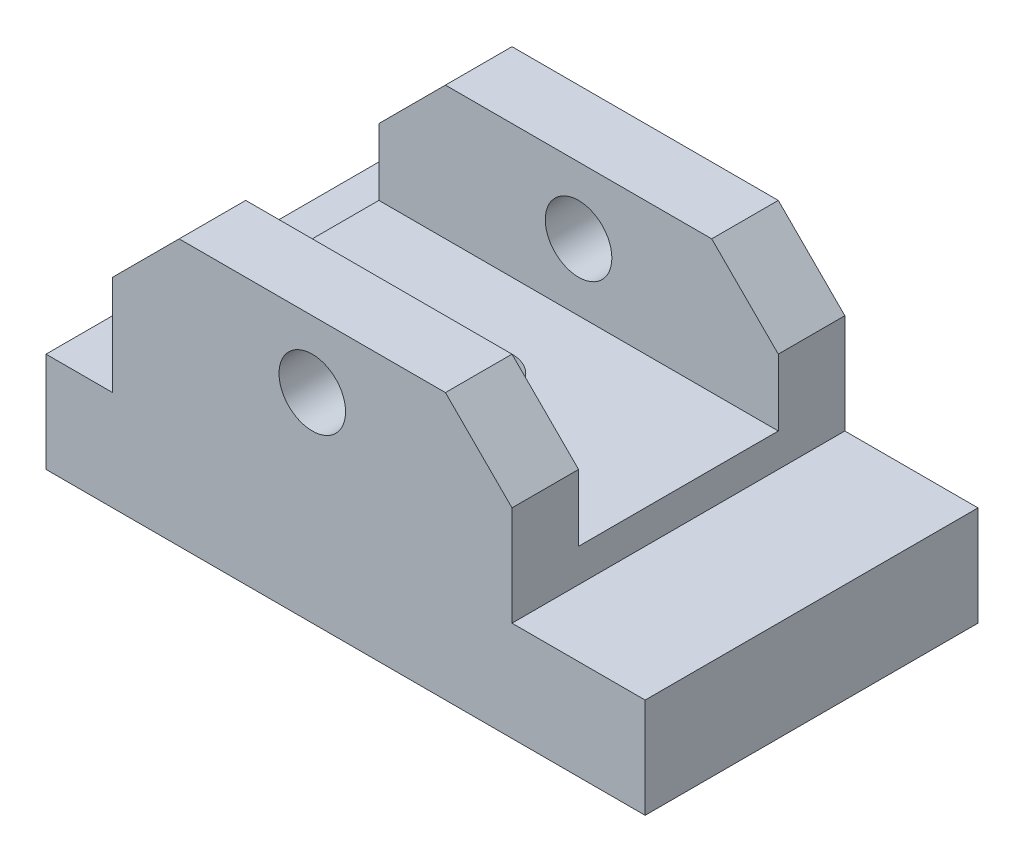
ISO-10303-21;
HEADER;
FILE_DESCRIPTION(('STEP AP214'),'2;1');
FILE_NAME('part.step','',(''),(''),'','','');
FILE_SCHEMA(('AUTOMOTIVE_DESIGN { 1 0 10303 214 1 1 1 1 }'));
ENDSEC;
DATA;
#1=APPLICATION_CONTEXT('core data for automotive mechanical design processes');
#2=APPLICATION_PROTOCOL_DEFINITION('international standard','automotive_design',2000,#1);
#3=PRODUCT_CONTEXT('',#1,'mechanical');
#4=PRODUCT('Part','Part','',(#3));
#5=PRODUCT_RELATED_PRODUCT_CATEGORY('part','',(#4));
#6=PRODUCT_DEFINITION_FORMATION('','',#4);
#7=PRODUCT_DEFINITION_CONTEXT('part definition',#1,'design');
#8=PRODUCT_DEFINITION('design','',#6,#7);
#9=PRODUCT_DEFINITION_SHAPE('','',#8);
#10=(LENGTH_UNIT() NAMED_UNIT(*) SI_UNIT(.MILLI.,.METRE.));
#11=(NAMED_UNIT(*) PLANE_ANGLE_UNIT() SI_UNIT($,.RADIAN.));
#12=(NAMED_UNIT(*) SI_UNIT($,.STERADIAN.) SOLID_ANGLE_UNIT());
#13=UNCERTAINTY_MEASURE_WITH_UNIT(LENGTH_MEASURE(1.E-05),#10,'distance_accuracy_value','');
#14=(GEOMETRIC_REPRESENTATION_CONTEXT(3) GLOBAL_UNCERTAINTY_ASSIGNED_CONTEXT((#13)) GLOBAL_UNIT_ASSIGNED_CONTEXT((#10,
#11,#12)) REPRESENTATION_CONTEXT('',''));
#15=CARTESIAN_POINT('',(0.,0.,0.));
#16=DIRECTION('',(0.,0.,1.));
#17=DIRECTION('',(1.,0.,0.));
#18=AXIS2_PLACEMENT_3D('',#15,#16,#17);
#19=CARTESIAN_POINT('',(9.99999999999998,15.,0.));
#20=DIRECTION('',(-0.707106781186548,0.707106781186548,0.));
#21=DIRECTION('',(-0.707106781186548,-0.707106781186548,0.));
#22=AXIS2_PLACEMENT_3D('',#19,#20,#21);
#23=PLANE('',#22);
#24=DIRECTION('',(0.707106781186548,0.707106781186548,0.));
#25=VECTOR('',#24,1.);
#26=CARTESIAN_POINT('',(9.99999999999998,15.,40.));
#27=LINE('',#26,#25);
#28=CARTESIAN_POINT('',(9.99999999999998,15.,40.));
#29=VERTEX_POINT('',#28);
#30=CARTESIAN_POINT('',(20.,25.,40.));
#31=VERTEX_POINT('',#30);
#32=EDGE_CURVE('E174',#29,#31,#27,.T.);
#33=ORIENTED_EDGE('',*,*,#32,.F.);
#34=DIRECTION('',(0.,0.,1.));
#35=VECTOR('',#34,1.);
#36=CARTESIAN_POINT('',(9.99999999999998,15.,0.));
#37=LINE('',#36,#35);
#38=CARTESIAN_POINT('',(9.99999999999998,15.,50.));
#39=VERTEX_POINT('',#38);
#40=EDGE_CURVE('E191',#29,#39,#37,.T.);
#41=ORIENTED_EDGE('',*,*,#40,.T.);
#42=DIRECTION('',(-0.707106781186548,-0.707106781186548,0.));
#43=VECTOR('',#42,1.);
#44=CARTESIAN_POINT('',(9.99999999999998,15.,50.));
#45=LINE('',#44,#43);
#46=CARTESIAN_POINT('',(20.,25.,50.));
#47=VERTEX_POINT('',#46);
#48=EDGE_CURVE('E370',#47,#39,#45,.T.);
#49=ORIENTED_EDGE('',*,*,#48,.F.);
#50=DIRECTION('',(0.,0.,1.));
#51=VECTOR('',#50,1.);
#52=CARTESIAN_POINT('',(20.,25.,0.));
#53=LINE('',#52,#51);
#54=EDGE_CURVE('E192',#31,#47,#53,.T.);
#55=ORIENTED_EDGE('',*,*,#54,.F.);
#56=EDGE_LOOP('',(#33,#41,#49,#55));
#57=FACE_BOUND('',#56,.T.);
#58=ADVANCED_FACE('F41',(#57),#23,.T.);
#59=CARTESIAN_POINT('',(60.,25.,0.));
#60=DIRECTION('',(0.707106781186547,0.707106781186548,0.));
#61=DIRECTION('',(-0.707106781186548,0.707106781186547,0.));
#62=AXIS2_PLACEMENT_3D('',#59,#60,#61);
#63=PLANE('',#62);
#64=DIRECTION('',(0.,0.,1.));
#65=VECTOR('',#64,1.);
#66=CARTESIAN_POINT('',(70.,15.,0.));
#67=LINE('',#66,#65);
#68=CARTESIAN_POINT('',(70.,15.,40.));
#69=VERTEX_POINT('',#68);
#70=CARTESIAN_POINT('',(70.,15.,50.));
#71=VERTEX_POINT('',#70);
#72=EDGE_CURVE('E203',#69,#71,#67,.T.);
#73=ORIENTED_EDGE('',*,*,#72,.F.);
#74=DIRECTION('',(-0.707106781186548,0.707106781186547,0.));
#75=VECTOR('',#74,1.);
#76=CARTESIAN_POINT('',(60.,25.,40.));
#77=LINE('',#76,#75);
#78=CARTESIAN_POINT('',(60.,25.,40.));
#79=VERTEX_POINT('',#78);
#80=EDGE_CURVE('E345',#69,#79,#77,.T.);
#81=ORIENTED_EDGE('',*,*,#80,.T.);
#82=DIRECTION('',(0.,0.,1.));
#83=VECTOR('',#82,1.);
#84=CARTESIAN_POINT('',(60.,25.,0.));
#85=LINE('',#84,#83);
#86=CARTESIAN_POINT('',(60.,25.,50.));
#87=VERTEX_POINT('',#86);
#88=EDGE_CURVE('E199',#79,#87,#85,.T.);
#89=ORIENTED_EDGE('',*,*,#88,.T.);
#90=DIRECTION('',(-0.707106781186548,0.707106781186547,0.));
#91=VECTOR('',#90,1.);
#92=CARTESIAN_POINT('',(60.,25.,50.));
#93=LINE('',#92,#91);
#94=EDGE_CURVE('E364',#71,#87,#93,.T.);
#95=ORIENTED_EDGE('',*,*,#94,.F.);
#96=EDGE_LOOP('',(#73,#81,#89,#95));
#97=FACE_BOUND('',#96,.T.);
#98=ADVANCED_FACE('F263',(#97),#63,.T.);
#99=CARTESIAN_POINT('',(60.,25.,0.));
#100=VERTEX_POINT('',#99);
#101=CARTESIAN_POINT('',(60.,25.,10.));
#102=VERTEX_POINT('',#101);
#103=EDGE_CURVE('E195',#100,#102,#85,.T.);
#104=ORIENTED_EDGE('',*,*,#103,.T.);
#105=DIRECTION('',(0.707106781186548,-0.707106781186547,0.));
#106=VECTOR('',#105,1.);
#107=CARTESIAN_POINT('',(60.,25.,10.));
#108=LINE('',#107,#106);
#109=CARTESIAN_POINT('',(70.,15.,10.));
#110=VERTEX_POINT('',#109);
#111=EDGE_CURVE('E181',#102,#110,#108,.T.);
#112=ORIENTED_EDGE('',*,*,#111,.T.);
#113=CARTESIAN_POINT('',(70.,15.,0.));
#114=VERTEX_POINT('',#113);
#115=EDGE_CURVE('E200',#114,#110,#67,.T.);
#116=ORIENTED_EDGE('',*,*,#115,.F.);
#117=DIRECTION('',(-0.707106781186548,0.707106781186547,0.));
#118=VECTOR('',#117,1.);
#119=CARTESIAN_POINT('',(60.,25.,0.));
#120=LINE('',#119,#118);
#121=EDGE_CURVE('E355',#114,#100,#120,.T.);
#122=ORIENTED_EDGE('',*,*,#121,.T.);
#123=EDGE_LOOP('',(#104,#112,#116,#122));
#124=FACE_BOUND('',#123,.T.);
#125=ADVANCED_FACE('F269',(#124),#63,.T.);
#126=CARTESIAN_POINT('',(20.,25.,0.));
#127=DIRECTION('',(0.,1.,0.));
#128=DIRECTION('',(0.,0.,1.));
#129=AXIS2_PLACEMENT_3D('',#126,#127,#128);
#130=PLANE('',#129);
#131=DIRECTION('',(-1.,0.,0.));
#132=VECTOR('',#131,1.);
#133=CARTESIAN_POINT('',(20.,25.,10.));
#134=LINE('',#133,#132);
#135=CARTESIAN_POINT('',(20.,25.,10.));
#136=VERTEX_POINT('',#135);
#137=EDGE_CURVE('E178',#102,#136,#134,.T.);
#138=ORIENTED_EDGE('',*,*,#137,.F.);
#139=ORIENTED_EDGE('',*,*,#103,.F.);
#140=DIRECTION('',(-1.,0.,0.));
#141=VECTOR('',#140,1.);
#142=CARTESIAN_POINT('',(20.,25.,0.));
#143=LINE('',#142,#141);
#144=CARTESIAN_POINT('',(20.,25.,0.));
#145=VERTEX_POINT('',#144);
#146=EDGE_CURVE('E190',#100,#145,#143,.T.);
#147=ORIENTED_EDGE('',*,*,#146,.T.);
#148=EDGE_CURVE('E168',#145,#136,#53,.T.);
#149=ORIENTED_EDGE('',*,*,#148,.T.);
#150=EDGE_LOOP('',(#138,#139,#147,#149));
#151=FACE_BOUND('',#150,.T.);
#152=ADVANCED_FACE('F188',(#151),#130,.T.);
#153=CARTESIAN_POINT('',(0.,0.,50.));
#154=DIRECTION('',(0.,-1.,0.));
#155=DIRECTION('',(1.,0.,0.));
#156=AXIS2_PLACEMENT_3D('',#153,#154,#155);
#157=PLANE('',#156);
#158=DIRECTION('',(0.,0.,1.));
#159=VECTOR('',#158,1.);
#160=CARTESIAN_POINT('',(9.99999999999998,0.,0.));
#161=LINE('',#160,#159);
#162=CARTESIAN_POINT('',(9.99999999999998,0.,0.));
#163=VERTEX_POINT('',#162);
#164=CARTESIAN_POINT('',(9.99999999999998,0.,50.));
#165=VERTEX_POINT('',#164);
#166=EDGE_CURVE('E219',#163,#165,#161,.T.);
#167=ORIENTED_EDGE('',*,*,#166,.F.);
#168=DIRECTION('',(-1.,0.,0.));
#169=VECTOR('',#168,1.);
#170=CARTESIAN_POINT('',(0.,0.,0.));
#171=LINE('',#170,#169);
#172=CARTESIAN_POINT('',(0.,0.,0.));
#173=VERTEX_POINT('',#172);
#174=EDGE_CURVE('E218',#163,#173,#171,.T.);
#175=ORIENTED_EDGE('',*,*,#174,.T.);
#176=DIRECTION('',(0.,0.,-1.));
#177=VECTOR('',#176,1.);
#178=CARTESIAN_POINT('',(0.,0.,50.));
#179=LINE('',#178,#177);
#180=CARTESIAN_POINT('',(0.,0.,50.));
#181=VERTEX_POINT('',#180);
#182=EDGE_CURVE('E50',#181,#173,#179,.T.);
#183=ORIENTED_EDGE('',*,*,#182,.F.);
#184=DIRECTION('',(-1.,0.,0.));
#185=VECTOR('',#184,1.);
#186=CARTESIAN_POINT('',(0.,0.,50.));
#187=LINE('',#186,#185);
#188=EDGE_CURVE('E209',#165,#181,#187,.T.);
#189=ORIENTED_EDGE('',*,*,#188,.F.);
#190=EDGE_LOOP('',(#167,#175,#183,#189));
#191=FACE_BOUND('',#190,.T.);
#192=ADVANCED_FACE('F378',(#191),#157,.F.);
#193=CARTESIAN_POINT('',(90.,0.,50.));
#194=DIRECTION('',(-1.,0.,0.));
#195=DIRECTION('',(0.,0.,1.));
#196=AXIS2_PLACEMENT_3D('',#193,#194,#195);
#197=PLANE('',#196);
#198=DIRECTION('',(0.,1.,0.));
#199=VECTOR('',#198,1.);
#200=CARTESIAN_POINT('',(90.,0.,0.));
#201=LINE('',#200,#199);
#202=CARTESIAN_POINT('',(90.,-15.,0.));
#203=VERTEX_POINT('',#202);
#204=CARTESIAN_POINT('',(90.,0.,0.));
#205=VERTEX_POINT('',#204);
#206=EDGE_CURVE('E215',#203,#205,#201,.T.);
#207=ORIENTED_EDGE('',*,*,#206,.T.);
#208=DIRECTION('',(0.,0.,-1.));
#209=VECTOR('',#208,1.);
#210=CARTESIAN_POINT('',(90.,0.,50.));
#211=LINE('',#210,#209);
#212=CARTESIAN_POINT('',(90.,0.,50.));
#213=VERTEX_POINT('',#212);
#214=EDGE_CURVE('E11',#213,#205,#211,.T.);
#215=ORIENTED_EDGE('',*,*,#214,.F.);
#216=DIRECTION('',(0.,1.,0.));
#217=VECTOR('',#216,1.);
#218=CARTESIAN_POINT('',(90.,0.,50.));
#219=LINE('',#218,#217);
#220=CARTESIAN_POINT('',(90.,-15.,50.));
#221=VERTEX_POINT('',#220);
#222=EDGE_CURVE('E207',#221,#213,#219,.T.);
#223=ORIENTED_EDGE('',*,*,#222,.F.);
#224=DIRECTION('',(0.,0.,-1.));
#225=VECTOR('',#224,1.);
#226=CARTESIAN_POINT('',(90.,-15.,50.));
#227=LINE('',#226,#225);
#228=EDGE_CURVE('E214',#221,#203,#227,.T.);
#229=ORIENTED_EDGE('',*,*,#228,.T.);
#230=EDGE_LOOP('',(#207,#215,#223,#229));
#231=FACE_BOUND('',#230,.T.);
#232=ADVANCED_FACE('F43',(#231),#197,.F.);
#233=CARTESIAN_POINT('',(70.,0.,0.));
#234=VERTEX_POINT('',#233);
#235=EDGE_CURVE('E220',#205,#234,#171,.T.);
#236=ORIENTED_EDGE('',*,*,#235,.T.);
#237=DIRECTION('',(0.,0.,1.));
#238=VECTOR('',#237,1.);
#239=CARTESIAN_POINT('',(70.,0.,0.));
#240=LINE('',#239,#238);
#241=CARTESIAN_POINT('',(70.,0.,50.));
#242=VERTEX_POINT('',#241);
#243=EDGE_CURVE('E204',#234,#242,#240,.T.);
#244=ORIENTED_EDGE('',*,*,#243,.T.);
#245=EDGE_CURVE('E93',#213,#242,#187,.T.);
#246=ORIENTED_EDGE('',*,*,#245,.F.);
#247=ORIENTED_EDGE('',*,*,#214,.T.);
#248=EDGE_LOOP('',(#236,#244,#246,#247));
#249=FACE_BOUND('',#248,.T.);
#250=ADVANCED_FACE('F258',(#249),#157,.F.);
#251=CARTESIAN_POINT('',(0.,0.,50.));
#252=DIRECTION('',(1.,0.,0.));
#253=DIRECTION('',(0.,0.,-1.));
#254=AXIS2_PLACEMENT_3D('',#251,#252,#253);
#255=PLANE('',#254);
#256=DIRECTION('',(0.,-1.,0.));
#257=VECTOR('',#256,1.);
#258=CARTESIAN_POINT('',(0.,0.,0.));
#259=LINE('',#258,#257);
#260=CARTESIAN_POINT('',(0.,-15.,0.));
#261=VERTEX_POINT('',#260);
#262=EDGE_CURVE('E223',#173,#261,#259,.T.);
#263=ORIENTED_EDGE('',*,*,#262,.T.);
#264=DIRECTION('',(0.,0.,-1.));
#265=VECTOR('',#264,1.);
#266=CARTESIAN_POINT('',(0.,-15.,50.));
#267=LINE('',#266,#265);
#268=CARTESIAN_POINT('',(0.,-15.,50.));
#269=VERTEX_POINT('',#268);
#270=EDGE_CURVE('E227',#269,#261,#267,.T.);
#271=ORIENTED_EDGE('',*,*,#270,.F.);
#272=DIRECTION('',(0.,-1.,0.));
#273=VECTOR('',#272,1.);
#274=CARTESIAN_POINT('',(0.,0.,50.));
#275=LINE('',#274,#273);
#276=EDGE_CURVE('E211',#181,#269,#275,.T.);
#277=ORIENTED_EDGE('',*,*,#276,.F.);
#278=ORIENTED_EDGE('',*,*,#182,.T.);
#279=EDGE_LOOP('',(#263,#271,#277,#278));
#280=FACE_BOUND('',#279,.T.);
#281=ADVANCED_FACE('F234',(#280),#255,.F.);
#282=CARTESIAN_POINT('',(0.,-15.,50.));
#283=DIRECTION('',(0.,1.,0.));
#284=DIRECTION('',(0.,0.,1.));
#285=AXIS2_PLACEMENT_3D('',#282,#283,#284);
#286=PLANE('',#285);
#287=CARTESIAN_POINT('',(40.,-15.,25.));
#288=DIRECTION('',(0.,1.,0.));
#289=DIRECTION('',(0.,0.,1.));
#290=AXIS2_PLACEMENT_3D('',#287,#288,#289);
#291=CIRCLE('',#290,5.);
#292=CARTESIAN_POINT('',(40.,-15.,30.));
#293=VERTEX_POINT('',#292);
#294=EDGE_CURVE('E312',#293,#293,#291,.T.);
#295=ORIENTED_EDGE('',*,*,#294,.T.);
#296=EDGE_LOOP('',(#295));
#297=FACE_BOUND('',#296,.T.);
#298=DIRECTION('',(1.,0.,0.));
#299=VECTOR('',#298,1.);
#300=CARTESIAN_POINT('',(0.,-15.,0.));
#301=LINE('',#300,#299);
#302=EDGE_CURVE('E87',#261,#203,#301,.T.);
#303=ORIENTED_EDGE('',*,*,#302,.T.);
#304=ORIENTED_EDGE('',*,*,#228,.F.);
#305=DIRECTION('',(1.,0.,0.));
#306=VECTOR('',#305,1.);
#307=CARTESIAN_POINT('',(0.,-15.,50.));
#308=LINE('',#307,#306);
#309=EDGE_CURVE('E66',#269,#221,#308,.T.);
#310=ORIENTED_EDGE('',*,*,#309,.F.);
#311=ORIENTED_EDGE('',*,*,#270,.T.);
#312=EDGE_LOOP('',(#303,#304,#310,#311));
#313=FACE_BOUND('',#312,.T.);
#314=ADVANCED_FACE('F247',(#297,#313),#286,.F.);
#315=CARTESIAN_POINT('',(0.,0.,50.));
#316=DIRECTION('',(0.,0.,1.));
#317=DIRECTION('',(1.,0.,0.));
#318=AXIS2_PLACEMENT_3D('',#315,#316,#317);
#319=PLANE('',#318);
#320=CARTESIAN_POINT('',(40.,15.,50.));
#321=DIRECTION('',(0.,0.,1.));
#322=DIRECTION('',(1.,0.,0.));
#323=AXIS2_PLACEMENT_3D('',#320,#321,#322);
#324=CIRCLE('',#323,5.);
#325=CARTESIAN_POINT('',(45.,15.,50.));
#326=VERTEX_POINT('',#325);
#327=EDGE_CURVE('E175',#326,#326,#324,.T.);
#328=ORIENTED_EDGE('',*,*,#327,.F.);
#329=EDGE_LOOP('',(#328));
#330=FACE_BOUND('',#329,.T.);
#331=ORIENTED_EDGE('',*,*,#222,.T.);
#332=ORIENTED_EDGE('',*,*,#245,.T.);
#333=DIRECTION('',(0.,1.,0.));
#334=VECTOR('',#333,1.);
#335=CARTESIAN_POINT('',(70.,15.,50.));
#336=LINE('',#335,#334);
#337=EDGE_CURVE('E57',#242,#71,#336,.T.);
#338=ORIENTED_EDGE('',*,*,#337,.T.);
#339=ORIENTED_EDGE('',*,*,#94,.T.);
#340=DIRECTION('',(-1.,0.,0.));
#341=VECTOR('',#340,1.);
#342=CARTESIAN_POINT('',(20.,25.,50.));
#343=LINE('',#342,#341);
#344=EDGE_CURVE('E367',#87,#47,#343,.T.);
#345=ORIENTED_EDGE('',*,*,#344,.T.);
#346=ORIENTED_EDGE('',*,*,#48,.T.);
#347=DIRECTION('',(0.,-1.,0.));
#348=VECTOR('',#347,1.);
#349=CARTESIAN_POINT('',(9.99999999999998,0.,50.));
#350=LINE('',#349,#348);
#351=EDGE_CURVE('E356',#39,#165,#350,.T.);
#352=ORIENTED_EDGE('',*,*,#351,.T.);
#353=ORIENTED_EDGE('',*,*,#188,.T.);
#354=ORIENTED_EDGE('',*,*,#276,.T.);
#355=ORIENTED_EDGE('',*,*,#309,.T.);
#356=EDGE_LOOP('',(#331,#332,#338,#339,#345,#346,#352,#353,#354,#355));
#357=FACE_BOUND('',#356,.T.);
#358=ADVANCED_FACE('F249',(#330,#357),#319,.T.);
#359=CARTESIAN_POINT('',(0.,0.,0.));
#360=DIRECTION('',(0.,0.,1.));
#361=DIRECTION('',(1.,0.,0.));
#362=AXIS2_PLACEMENT_3D('',#359,#360,#361);
#363=PLANE('',#362);
#364=CARTESIAN_POINT('',(40.,15.,0.));
#365=DIRECTION('',(0.,0.,1.));
#366=DIRECTION('',(1.,0.,0.));
#367=AXIS2_PLACEMENT_3D('',#364,#365,#366);
#368=CIRCLE('',#367,5.);
#369=CARTESIAN_POINT('',(45.,15.,0.));
#370=VERTEX_POINT('',#369);
#371=EDGE_CURVE('E317',#370,#370,#368,.T.);
#372=ORIENTED_EDGE('',*,*,#371,.T.);
#373=EDGE_LOOP('',(#372));
#374=FACE_BOUND('',#373,.T.);
#375=ORIENTED_EDGE('',*,*,#206,.F.);
#376=ORIENTED_EDGE('',*,*,#302,.F.);
#377=ORIENTED_EDGE('',*,*,#262,.F.);
#378=ORIENTED_EDGE('',*,*,#174,.F.);
#379=DIRECTION('',(0.,-1.,0.));
#380=VECTOR('',#379,1.);
#381=CARTESIAN_POINT('',(9.99999999999998,0.,0.));
#382=LINE('',#381,#380);
#383=CARTESIAN_POINT('',(9.99999999999998,15.,0.));
#384=VERTEX_POINT('',#383);
#385=EDGE_CURVE('E206',#384,#163,#382,.T.);
#386=ORIENTED_EDGE('',*,*,#385,.F.);
#387=DIRECTION('',(-0.707106781186548,-0.707106781186548,0.));
#388=VECTOR('',#387,1.);
#389=CARTESIAN_POINT('',(9.99999999999998,15.,0.));
#390=LINE('',#389,#388);
#391=EDGE_CURVE('E360',#145,#384,#390,.T.);
#392=ORIENTED_EDGE('',*,*,#391,.F.);
#393=ORIENTED_EDGE('',*,*,#146,.F.);
#394=ORIENTED_EDGE('',*,*,#121,.F.);
#395=DIRECTION('',(0.,1.,0.));
#396=VECTOR('',#395,1.);
#397=CARTESIAN_POINT('',(70.,15.,0.));
#398=LINE('',#397,#396);
#399=EDGE_CURVE('E352',#234,#114,#398,.T.);
#400=ORIENTED_EDGE('',*,*,#399,.F.);
#401=ORIENTED_EDGE('',*,*,#235,.F.);
#402=EDGE_LOOP('',(#375,#376,#377,#378,#386,#392,#393,#394,#400,#401));
#403=FACE_BOUND('',#402,.T.);
#404=ADVANCED_FACE('F241',(#374,#403),#363,.F.);
#405=CARTESIAN_POINT('',(9.99999999999998,0.,0.));
#406=DIRECTION('',(-1.,0.,0.));
#407=DIRECTION('',(0.,0.,1.));
#408=AXIS2_PLACEMENT_3D('',#405,#406,#407);
#409=PLANE('',#408);
#410=DIRECTION('',(0.,-1.,0.));
#411=VECTOR('',#410,1.);
#412=CARTESIAN_POINT('',(9.99999999999998,0.,10.));
#413=LINE('',#412,#411);
#414=CARTESIAN_POINT('',(9.99999999999998,15.,10.));
#415=VERTEX_POINT('',#414);
#416=CARTESIAN_POINT('',(9.99999999999998,4.99999999999999,10.));
#417=VERTEX_POINT('',#416);
#418=EDGE_CURVE('E342',#415,#417,#413,.T.);
#419=ORIENTED_EDGE('',*,*,#418,.F.);
#420=EDGE_CURVE('E170',#384,#415,#37,.T.);
#421=ORIENTED_EDGE('',*,*,#420,.F.);
#422=ORIENTED_EDGE('',*,*,#385,.T.);
#423=ORIENTED_EDGE('',*,*,#166,.T.);
#424=ORIENTED_EDGE('',*,*,#351,.F.);
#425=ORIENTED_EDGE('',*,*,#40,.F.);
#426=DIRECTION('',(0.,1.,0.));
#427=VECTOR('',#426,1.);
#428=CARTESIAN_POINT('',(9.99999999999998,0.,40.));
#429=LINE('',#428,#427);
#430=CARTESIAN_POINT('',(9.99999999999998,4.99999999999999,40.));
#431=VERTEX_POINT('',#430);
#432=EDGE_CURVE('E331',#431,#29,#429,.T.);
#433=ORIENTED_EDGE('',*,*,#432,.F.);
#434=DIRECTION('',(0.,0.,1.));
#435=VECTOR('',#434,1.);
#436=CARTESIAN_POINT('',(9.99999999999998,4.99999999999999,0.));
#437=LINE('',#436,#435);
#438=EDGE_CURVE('E337',#417,#431,#437,.T.);
#439=ORIENTED_EDGE('',*,*,#438,.F.);
#440=EDGE_LOOP('',(#419,#421,#422,#423,#424,#425,#433,#439));
#441=FACE_BOUND('',#440,.T.);
#442=ADVANCED_FACE('F276',(#441),#409,.T.);
#443=DIRECTION('',(-0.707106781186548,-0.707106781186548,0.));
#444=VECTOR('',#443,1.);
#445=CARTESIAN_POINT('',(9.99999999999999,15.,10.));
#446=LINE('',#445,#444);
#447=EDGE_CURVE('E163',#136,#415,#446,.T.);
#448=ORIENTED_EDGE('',*,*,#447,.F.);
#449=ORIENTED_EDGE('',*,*,#148,.F.);
#450=ORIENTED_EDGE('',*,*,#391,.T.);
#451=ORIENTED_EDGE('',*,*,#420,.T.);
#452=EDGE_LOOP('',(#448,#449,#450,#451));
#453=FACE_BOUND('',#452,.T.);
#454=ADVANCED_FACE('F165',(#453),#23,.T.);
#455=DIRECTION('',(1.,0.,0.));
#456=VECTOR('',#455,1.);
#457=CARTESIAN_POINT('',(60.,25.,40.));
#458=LINE('',#457,#456);
#459=EDGE_CURVE('E185',#31,#79,#458,.T.);
#460=ORIENTED_EDGE('',*,*,#459,.F.);
#461=ORIENTED_EDGE('',*,*,#54,.T.);
#462=ORIENTED_EDGE('',*,*,#344,.F.);
#463=ORIENTED_EDGE('',*,*,#88,.F.);
#464=EDGE_LOOP('',(#460,#461,#462,#463));
#465=FACE_BOUND('',#464,.T.);
#466=ADVANCED_FACE('F275',(#465),#130,.T.);
#467=CARTESIAN_POINT('',(70.,15.,0.));
#468=DIRECTION('',(1.,0.,0.));
#469=DIRECTION('',(0.,0.,-1.));
#470=AXIS2_PLACEMENT_3D('',#467,#468,#469);
#471=PLANE('',#470);
#472=DIRECTION('',(0.,1.,0.));
#473=VECTOR('',#472,1.);
#474=CARTESIAN_POINT('',(70.,15.,10.));
#475=LINE('',#474,#473);
#476=CARTESIAN_POINT('',(70.,4.99999999999999,10.));
#477=VERTEX_POINT('',#476);
#478=EDGE_CURVE('E340',#477,#110,#475,.T.);
#479=ORIENTED_EDGE('',*,*,#478,.F.);
#480=DIRECTION('',(0.,0.,-1.));
#481=VECTOR('',#480,1.);
#482=CARTESIAN_POINT('',(70.,4.99999999999999,0.));
#483=LINE('',#482,#481);
#484=CARTESIAN_POINT('',(70.,4.99999999999999,40.));
#485=VERTEX_POINT('',#484);
#486=EDGE_CURVE('E334',#485,#477,#483,.T.);
#487=ORIENTED_EDGE('',*,*,#486,.F.);
#488=DIRECTION('',(0.,-1.,0.));
#489=VECTOR('',#488,1.);
#490=CARTESIAN_POINT('',(70.,15.,40.));
#491=LINE('',#490,#489);
#492=EDGE_CURVE('E328',#69,#485,#491,.T.);
#493=ORIENTED_EDGE('',*,*,#492,.F.);
#494=ORIENTED_EDGE('',*,*,#72,.T.);
#495=ORIENTED_EDGE('',*,*,#337,.F.);
#496=ORIENTED_EDGE('',*,*,#243,.F.);
#497=ORIENTED_EDGE('',*,*,#399,.T.);
#498=ORIENTED_EDGE('',*,*,#115,.T.);
#499=EDGE_LOOP('',(#479,#487,#493,#494,#495,#496,#497,#498));
#500=FACE_BOUND('',#499,.T.);
#501=ADVANCED_FACE('F281',(#500),#471,.T.);
#502=CARTESIAN_POINT('',(20.,4.99999999999999,10.));
#503=DIRECTION('',(0.,0.,-1.));
#504=DIRECTION('',(-1.,0.,0.));
#505=AXIS2_PLACEMENT_3D('',#502,#503,#504);
#506=PLANE('',#505);
#507=CARTESIAN_POINT('',(40.,15.,10.));
#508=DIRECTION('',(0.,0.,-1.));
#509=DIRECTION('',(-1.,0.,0.));
#510=AXIS2_PLACEMENT_3D('',#507,#508,#509);
#511=CIRCLE('',#510,5.);
#512=CARTESIAN_POINT('',(35.,15.,10.));
#513=VERTEX_POINT('',#512);
#514=EDGE_CURVE('E322',#513,#513,#511,.T.);
#515=ORIENTED_EDGE('',*,*,#514,.T.);
#516=EDGE_LOOP('',(#515));
#517=FACE_BOUND('',#516,.T.);
#518=ORIENTED_EDGE('',*,*,#137,.T.);
#519=ORIENTED_EDGE('',*,*,#447,.T.);
#520=ORIENTED_EDGE('',*,*,#418,.T.);
#521=DIRECTION('',(-1.,0.,0.));
#522=VECTOR('',#521,1.);
#523=CARTESIAN_POINT('',(20.,4.99999999999999,10.));
#524=LINE('',#523,#522);
#525=EDGE_CURVE('E348',#477,#417,#524,.T.);
#526=ORIENTED_EDGE('',*,*,#525,.F.);
#527=ORIENTED_EDGE('',*,*,#478,.T.);
#528=ORIENTED_EDGE('',*,*,#111,.F.);
#529=EDGE_LOOP('',(#518,#519,#520,#526,#527,#528));
#530=FACE_BOUND('',#529,.T.);
#531=ADVANCED_FACE('F179',(#517,#530),#506,.F.);
#532=CARTESIAN_POINT('',(60.,4.99999999999999,40.));
#533=DIRECTION('',(0.,0.,1.));
#534=DIRECTION('',(1.,0.,0.));
#535=AXIS2_PLACEMENT_3D('',#532,#533,#534);
#536=PLANE('',#535);
#537=CARTESIAN_POINT('',(40.,15.,40.));
#538=DIRECTION('',(0.,0.,1.));
#539=DIRECTION('',(1.,0.,0.));
#540=AXIS2_PLACEMENT_3D('',#537,#538,#539);
#541=CIRCLE('',#540,5.);
#542=CARTESIAN_POINT('',(45.,15.,40.));
#543=VERTEX_POINT('',#542);
#544=EDGE_CURVE('E45',#543,#543,#541,.T.);
#545=ORIENTED_EDGE('',*,*,#544,.T.);
#546=EDGE_LOOP('',(#545));
#547=FACE_BOUND('',#546,.T.);
#548=ORIENTED_EDGE('',*,*,#32,.T.);
#549=ORIENTED_EDGE('',*,*,#459,.T.);
#550=ORIENTED_EDGE('',*,*,#80,.F.);
#551=ORIENTED_EDGE('',*,*,#492,.T.);
#552=DIRECTION('',(1.,0.,0.));
#553=VECTOR('',#552,1.);
#554=CARTESIAN_POINT('',(60.,4.99999999999999,40.));
#555=LINE('',#554,#553);
#556=EDGE_CURVE('E184',#431,#485,#555,.T.);
#557=ORIENTED_EDGE('',*,*,#556,.F.);
#558=ORIENTED_EDGE('',*,*,#432,.T.);
#559=EDGE_LOOP('',(#548,#549,#550,#551,#557,#558));
#560=FACE_BOUND('',#559,.T.);
#561=ADVANCED_FACE('F289',(#547,#560),#536,.F.);
#562=CARTESIAN_POINT('',(0.,4.99999999999999,0.));
#563=DIRECTION('',(0.,-1.,0.));
#564=DIRECTION('',(0.,0.,-1.));
#565=AXIS2_PLACEMENT_3D('',#562,#563,#564);
#566=PLANE('',#565);
#567=CARTESIAN_POINT('',(40.,4.99999999999999,25.));
#568=DIRECTION('',(0.,1.,0.));
#569=DIRECTION('',(0.,0.,1.));
#570=AXIS2_PLACEMENT_3D('',#567,#568,#569);
#571=CIRCLE('',#570,5.);
#572=CARTESIAN_POINT('',(40.,4.99999999999999,30.));
#573=VERTEX_POINT('',#572);
#574=EDGE_CURVE('E315',#573,#573,#571,.T.);
#575=ORIENTED_EDGE('',*,*,#574,.F.);
#576=EDGE_LOOP('',(#575));
#577=FACE_BOUND('',#576,.T.);
#578=ORIENTED_EDGE('',*,*,#525,.T.);
#579=ORIENTED_EDGE('',*,*,#438,.T.);
#580=ORIENTED_EDGE('',*,*,#556,.T.);
#581=ORIENTED_EDGE('',*,*,#486,.T.);
#582=EDGE_LOOP('',(#578,#579,#580,#581));
#583=FACE_BOUND('',#582,.T.);
#584=ADVANCED_FACE('F292',(#577,#583),#566,.F.);
#585=CARTESIAN_POINT('',(40.,15.,0.));
#586=DIRECTION('',(0.,0.,1.));
#587=DIRECTION('',(1.,0.,0.));
#588=AXIS2_PLACEMENT_3D('',#585,#586,#587);
#589=CYLINDRICAL_SURFACE('',#588,5.);
#590=ORIENTED_EDGE('',*,*,#327,.T.);
#591=EDGE_LOOP('',(#590));
#592=FACE_BOUND('',#591,.T.);
#593=ORIENTED_EDGE('',*,*,#544,.F.);
#594=EDGE_LOOP('',(#593));
#595=FACE_BOUND('',#594,.T.);
#596=ADVANCED_FACE('F299',(#592,#595),#589,.F.);
#597=ORIENTED_EDGE('',*,*,#371,.F.);
#598=EDGE_LOOP('',(#597));
#599=FACE_BOUND('',#598,.T.);
#600=ORIENTED_EDGE('',*,*,#514,.F.);
#601=EDGE_LOOP('',(#600));
#602=FACE_BOUND('',#601,.T.);
#603=ADVANCED_FACE('F301',(#599,#602),#589,.F.);
#604=CARTESIAN_POINT('',(40.,-15.,25.));
#605=DIRECTION('',(0.,1.,0.));
#606=DIRECTION('',(0.,0.,1.));
#607=AXIS2_PLACEMENT_3D('',#604,#605,#606);
#608=CYLINDRICAL_SURFACE('',#607,5.);
#609=ORIENTED_EDGE('',*,*,#294,.F.);
#610=EDGE_LOOP('',(#609));
#611=FACE_BOUND('',#610,.T.);
#612=ORIENTED_EDGE('',*,*,#574,.T.);
#613=EDGE_LOOP('',(#612));
#614=FACE_BOUND('',#613,.T.);
#615=ADVANCED_FACE('F304',(#611,#614),#608,.F.);
#616=CLOSED_SHELL('',(#58,#98,#125,#152,#192,#232,#250,#281,#314,#358,#404,#442,#454,#466,#501,
#531,#561,#584,#596,#603,#615));
#617=MANIFOLD_SOLID_BREP('B2',#616);
#618=ADVANCED_BREP_SHAPE_REPRESENTATION('',(#18,#617),#14);
#619=SHAPE_DEFINITION_REPRESENTATION(#9,#618);
ENDSEC;
END-ISO-10303-21;
